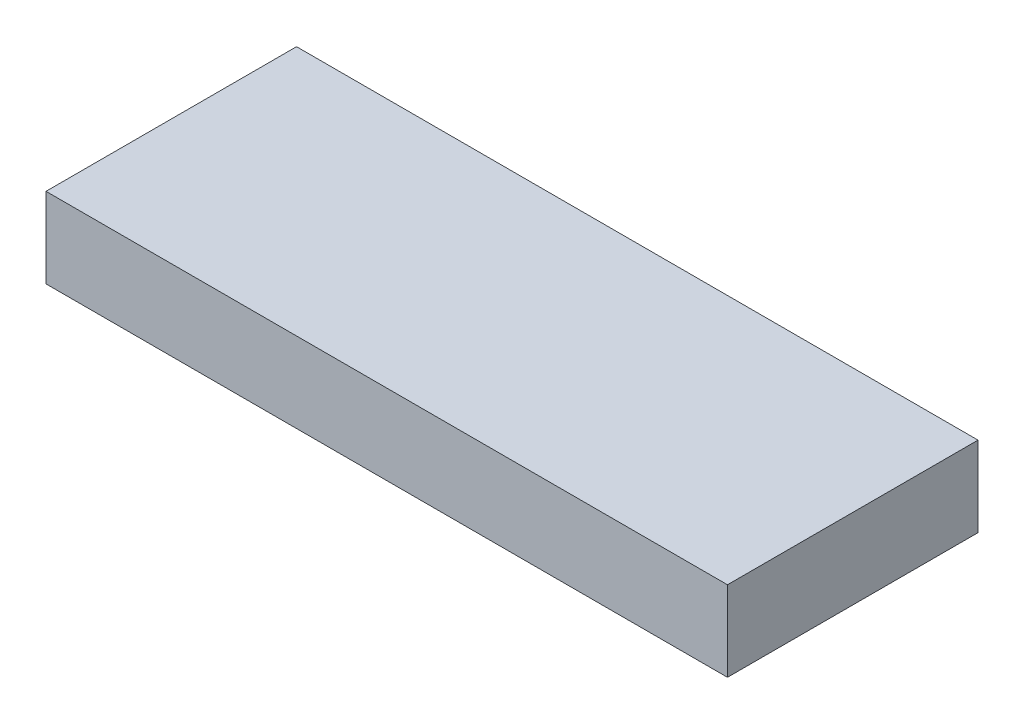
ISO-10303-21;
HEADER;
FILE_DESCRIPTION(('STEP AP214'),'2;1');
FILE_NAME('part.step','',(''),(''),'','','');
FILE_SCHEMA(('AUTOMOTIVE_DESIGN { 1 0 10303 214 1 1 1 1 }'));
ENDSEC;
DATA;
#1=APPLICATION_CONTEXT('core data for automotive mechanical design processes');
#2=APPLICATION_PROTOCOL_DEFINITION('international standard','automotive_design',2000,#1);
#3=PRODUCT_CONTEXT('',#1,'mechanical');
#4=PRODUCT('Part','Part','',(#3));
#5=PRODUCT_RELATED_PRODUCT_CATEGORY('part','',(#4));
#6=PRODUCT_DEFINITION_FORMATION('','',#4);
#7=PRODUCT_DEFINITION_CONTEXT('part definition',#1,'design');
#8=PRODUCT_DEFINITION('design','',#6,#7);
#9=PRODUCT_DEFINITION_SHAPE('','',#8);
#10=(LENGTH_UNIT() NAMED_UNIT(*) SI_UNIT(.MILLI.,.METRE.));
#11=(NAMED_UNIT(*) PLANE_ANGLE_UNIT() SI_UNIT($,.RADIAN.));
#12=(NAMED_UNIT(*) SI_UNIT($,.STERADIAN.) SOLID_ANGLE_UNIT());
#13=UNCERTAINTY_MEASURE_WITH_UNIT(LENGTH_MEASURE(1.E-05),#10,'distance_accuracy_value','');
#14=(GEOMETRIC_REPRESENTATION_CONTEXT(3) GLOBAL_UNCERTAINTY_ASSIGNED_CONTEXT((#13)) GLOBAL_UNIT_ASSIGNED_CONTEXT((#10,
#11,#12)) REPRESENTATION_CONTEXT('',''));
#15=CARTESIAN_POINT('',(0.,0.,0.));
#16=DIRECTION('',(0.,0.,1.));
#17=DIRECTION('',(1.,0.,0.));
#18=AXIS2_PLACEMENT_3D('',#15,#16,#17);
#19=CARTESIAN_POINT('',(0.,8.,0.));
#20=DIRECTION('',(-1.,0.,0.));
#21=DIRECTION('',(0.,0.,1.));
#22=AXIS2_PLACEMENT_3D('',#19,#20,#21);
#23=PLANE('',#22);
#24=DIRECTION('',(0.,0.,-1.));
#25=VECTOR('',#24,1.);
#26=CARTESIAN_POINT('',(0.,0.,0.));
#27=LINE('',#26,#25);
#28=CARTESIAN_POINT('',(0.,0.,0.));
#29=VERTEX_POINT('',#28);
#30=CARTESIAN_POINT('',(0.,0.,-25.));
#31=VERTEX_POINT('',#30);
#32=EDGE_CURVE('E103',#29,#31,#27,.T.);
#33=ORIENTED_EDGE('',*,*,#32,.T.);
#34=DIRECTION('',(0.,-1.,0.));
#35=VECTOR('',#34,1.);
#36=CARTESIAN_POINT('',(0.,8.,-25.));
#37=LINE('',#36,#35);
#38=CARTESIAN_POINT('',(0.,8.,-25.));
#39=VERTEX_POINT('',#38);
#40=EDGE_CURVE('E11',#39,#31,#37,.T.);
#41=ORIENTED_EDGE('',*,*,#40,.F.);
#42=DIRECTION('',(0.,0.,-1.));
#43=VECTOR('',#42,1.);
#44=CARTESIAN_POINT('',(0.,8.,0.));
#45=LINE('',#44,#43);
#46=CARTESIAN_POINT('',(0.,8.,0.));
#47=VERTEX_POINT('',#46);
#48=EDGE_CURVE('E91',#47,#39,#45,.T.);
#49=ORIENTED_EDGE('',*,*,#48,.F.);
#50=DIRECTION('',(0.,-1.,0.));
#51=VECTOR('',#50,1.);
#52=CARTESIAN_POINT('',(0.,8.,0.));
#53=LINE('',#52,#51);
#54=EDGE_CURVE('E99',#47,#29,#53,.T.);
#55=ORIENTED_EDGE('',*,*,#54,.T.);
#56=EDGE_LOOP('',(#33,#41,#49,#55));
#57=FACE_BOUND('',#56,.T.);
#58=ADVANCED_FACE('F40',(#57),#23,.F.);
#59=CARTESIAN_POINT('',(0.,8.,-25.));
#60=DIRECTION('',(0.,0.,1.));
#61=DIRECTION('',(1.,0.,0.));
#62=AXIS2_PLACEMENT_3D('',#59,#60,#61);
#63=PLANE('',#62);
#64=DIRECTION('',(-1.,0.,0.));
#65=VECTOR('',#64,1.);
#66=CARTESIAN_POINT('',(0.,0.,-25.));
#67=LINE('',#66,#65);
#68=CARTESIAN_POINT('',(-68.,0.,-25.));
#69=VERTEX_POINT('',#68);
#70=EDGE_CURVE('E95',#31,#69,#67,.T.);
#71=ORIENTED_EDGE('',*,*,#70,.T.);
#72=DIRECTION('',(0.,-1.,0.));
#73=VECTOR('',#72,1.);
#74=CARTESIAN_POINT('',(-68.,8.,-25.));
#75=LINE('',#74,#73);
#76=CARTESIAN_POINT('',(-68.,8.,-25.));
#77=VERTEX_POINT('',#76);
#78=EDGE_CURVE('E48',#77,#69,#75,.T.);
#79=ORIENTED_EDGE('',*,*,#78,.F.);
#80=DIRECTION('',(-1.,0.,0.));
#81=VECTOR('',#80,1.);
#82=CARTESIAN_POINT('',(0.,8.,-25.));
#83=LINE('',#82,#81);
#84=EDGE_CURVE('E86',#39,#77,#83,.T.);
#85=ORIENTED_EDGE('',*,*,#84,.F.);
#86=ORIENTED_EDGE('',*,*,#40,.T.);
#87=EDGE_LOOP('',(#71,#79,#85,#86));
#88=FACE_BOUND('',#87,.T.);
#89=ADVANCED_FACE('F94',(#88),#63,.F.);
#90=CARTESIAN_POINT('',(-68.,8.,0.));
#91=DIRECTION('',(1.,0.,0.));
#92=DIRECTION('',(0.,0.,-1.));
#93=AXIS2_PLACEMENT_3D('',#90,#91,#92);
#94=PLANE('',#93);
#95=DIRECTION('',(0.,0.,1.));
#96=VECTOR('',#95,1.);
#97=CARTESIAN_POINT('',(-68.,0.,0.));
#98=LINE('',#97,#96);
#99=CARTESIAN_POINT('',(-68.,0.,0.));
#100=VERTEX_POINT('',#99);
#101=EDGE_CURVE('E73',#69,#100,#98,.T.);
#102=ORIENTED_EDGE('',*,*,#101,.T.);
#103=DIRECTION('',(0.,-1.,0.));
#104=VECTOR('',#103,1.);
#105=CARTESIAN_POINT('',(-68.,8.,0.));
#106=LINE('',#105,#104);
#107=CARTESIAN_POINT('',(-68.,8.,0.));
#108=VERTEX_POINT('',#107);
#109=EDGE_CURVE('E96',#108,#100,#106,.T.);
#110=ORIENTED_EDGE('',*,*,#109,.F.);
#111=DIRECTION('',(0.,0.,1.));
#112=VECTOR('',#111,1.);
#113=CARTESIAN_POINT('',(-68.,8.,0.));
#114=LINE('',#113,#112);
#115=EDGE_CURVE('E89',#77,#108,#114,.T.);
#116=ORIENTED_EDGE('',*,*,#115,.F.);
#117=ORIENTED_EDGE('',*,*,#78,.T.);
#118=EDGE_LOOP('',(#102,#110,#116,#117));
#119=FACE_BOUND('',#118,.T.);
#120=ADVANCED_FACE('F97',(#119),#94,.F.);
#121=CARTESIAN_POINT('',(0.,8.,0.));
#122=DIRECTION('',(0.,0.,-1.));
#123=DIRECTION('',(-1.,0.,0.));
#124=AXIS2_PLACEMENT_3D('',#121,#122,#123);
#125=PLANE('',#124);
#126=DIRECTION('',(1.,0.,0.));
#127=VECTOR('',#126,1.);
#128=CARTESIAN_POINT('',(0.,0.,0.));
#129=LINE('',#128,#127);
#130=EDGE_CURVE('E79',#100,#29,#129,.T.);
#131=ORIENTED_EDGE('',*,*,#130,.T.);
#132=ORIENTED_EDGE('',*,*,#54,.F.);
#133=DIRECTION('',(1.,0.,0.));
#134=VECTOR('',#133,1.);
#135=CARTESIAN_POINT('',(0.,8.,0.));
#136=LINE('',#135,#134);
#137=EDGE_CURVE('E56',#108,#47,#136,.T.);
#138=ORIENTED_EDGE('',*,*,#137,.F.);
#139=ORIENTED_EDGE('',*,*,#109,.T.);
#140=EDGE_LOOP('',(#131,#132,#138,#139));
#141=FACE_BOUND('',#140,.T.);
#142=ADVANCED_FACE('F110',(#141),#125,.F.);
#143=CARTESIAN_POINT('',(0.,8.,0.));
#144=DIRECTION('',(0.,1.,0.));
#145=DIRECTION('',(0.,0.,1.));
#146=AXIS2_PLACEMENT_3D('',#143,#144,#145);
#147=PLANE('',#146);
#148=ORIENTED_EDGE('',*,*,#48,.T.);
#149=ORIENTED_EDGE('',*,*,#84,.T.);
#150=ORIENTED_EDGE('',*,*,#115,.T.);
#151=ORIENTED_EDGE('',*,*,#137,.T.);
#152=EDGE_LOOP('',(#148,#149,#150,#151));
#153=FACE_BOUND('',#152,.T.);
#154=ADVANCED_FACE('F87',(#153),#147,.T.);
#155=CARTESIAN_POINT('',(0.,0.,0.));
#156=DIRECTION('',(0.,1.,0.));
#157=DIRECTION('',(0.,0.,1.));
#158=AXIS2_PLACEMENT_3D('',#155,#156,#157);
#159=PLANE('',#158);
#160=ORIENTED_EDGE('',*,*,#32,.F.);
#161=ORIENTED_EDGE('',*,*,#130,.F.);
#162=ORIENTED_EDGE('',*,*,#101,.F.);
#163=ORIENTED_EDGE('',*,*,#70,.F.);
#164=EDGE_LOOP('',(#160,#161,#162,#163));
#165=FACE_BOUND('',#164,.T.);
#166=ADVANCED_FACE('F113',(#165),#159,.F.);
#167=CLOSED_SHELL('',(#58,#89,#120,#142,#154,#166));
#168=MANIFOLD_SOLID_BREP('B2',#167);
#169=ADVANCED_BREP_SHAPE_REPRESENTATION('',(#18,#168),#14);
#170=SHAPE_DEFINITION_REPRESENTATION(#9,#169);
ENDSEC;
END-ISO-10303-21;
